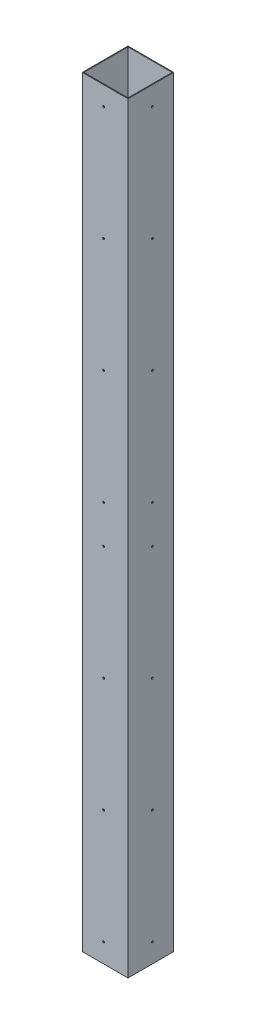
ISO-10303-21;
HEADER;
FILE_DESCRIPTION(('STEP AP214'),'2;1');
FILE_NAME('part.step','',(''),(''),'','','');
FILE_SCHEMA(('AUTOMOTIVE_DESIGN { 1 0 10303 214 1 1 1 1 }'));
ENDSEC;
DATA;
#1=APPLICATION_CONTEXT('core data for automotive mechanical design processes');
#2=APPLICATION_PROTOCOL_DEFINITION('international standard','automotive_design',2000,#1);
#3=PRODUCT_CONTEXT('',#1,'mechanical');
#4=PRODUCT('Part','Part','',(#3));
#5=PRODUCT_RELATED_PRODUCT_CATEGORY('part','',(#4));
#6=PRODUCT_DEFINITION_FORMATION('','',#4);
#7=PRODUCT_DEFINITION_CONTEXT('part definition',#1,'design');
#8=PRODUCT_DEFINITION('design','',#6,#7);
#9=PRODUCT_DEFINITION_SHAPE('','',#8);
#10=(LENGTH_UNIT() NAMED_UNIT(*) SI_UNIT(.MILLI.,.METRE.));
#11=(NAMED_UNIT(*) PLANE_ANGLE_UNIT() SI_UNIT($,.RADIAN.));
#12=(NAMED_UNIT(*) SI_UNIT($,.STERADIAN.) SOLID_ANGLE_UNIT());
#13=UNCERTAINTY_MEASURE_WITH_UNIT(LENGTH_MEASURE(1.E-05),#10,'distance_accuracy_value','');
#14=(GEOMETRIC_REPRESENTATION_CONTEXT(3) GLOBAL_UNCERTAINTY_ASSIGNED_CONTEXT((#13)) GLOBAL_UNIT_ASSIGNED_CONTEXT((#10,
#11,#12)) REPRESENTATION_CONTEXT('',''));
#15=CARTESIAN_POINT('',(0.,0.,0.));
#16=DIRECTION('',(0.,0.,1.));
#17=DIRECTION('',(1.,0.,0.));
#18=AXIS2_PLACEMENT_3D('',#15,#16,#17);
#19=CARTESIAN_POINT('',(0.,2000.,0.));
#20=DIRECTION('',(0.,1.,0.));
#21=DIRECTION('',(0.,0.,1.));
#22=AXIS2_PLACEMENT_3D('',#19,#20,#21);
#23=PLANE('',#22);
#24=DIRECTION('',(0.,0.,1.));
#25=VECTOR('',#24,1.);
#26=CARTESIAN_POINT('',(-60.,2000.,-60.));
#27=LINE('',#26,#25);
#28=CARTESIAN_POINT('',(-60.,2000.,-60.));
#29=VERTEX_POINT('',#28);
#30=CARTESIAN_POINT('',(-60.,2000.,60.));
#31=VERTEX_POINT('',#30);
#32=EDGE_CURVE('E164',#29,#31,#27,.T.);
#33=ORIENTED_EDGE('',*,*,#32,.T.);
#34=DIRECTION('',(1.,0.,0.));
#35=VECTOR('',#34,1.);
#36=CARTESIAN_POINT('',(-60.,2000.,60.));
#37=LINE('',#36,#35);
#38=CARTESIAN_POINT('',(60.,2000.,60.));
#39=VERTEX_POINT('',#38);
#40=EDGE_CURVE('E167',#31,#39,#37,.T.);
#41=ORIENTED_EDGE('',*,*,#40,.T.);
#42=DIRECTION('',(0.,0.,-1.));
#43=VECTOR('',#42,1.);
#44=CARTESIAN_POINT('',(60.,2000.,-60.));
#45=LINE('',#44,#43);
#46=CARTESIAN_POINT('',(60.,2000.,-60.));
#47=VERTEX_POINT('',#46);
#48=EDGE_CURVE('E170',#39,#47,#45,.T.);
#49=ORIENTED_EDGE('',*,*,#48,.T.);
#50=DIRECTION('',(-1.,0.,0.));
#51=VECTOR('',#50,1.);
#52=CARTESIAN_POINT('',(-60.,2000.,-60.));
#53=LINE('',#52,#51);
#54=EDGE_CURVE('E172',#47,#29,#53,.T.);
#55=ORIENTED_EDGE('',*,*,#54,.T.);
#56=EDGE_LOOP('',(#33,#41,#49,#55));
#57=FACE_BOUND('',#56,.T.);
#58=DIRECTION('',(1.,0.,0.));
#59=VECTOR('',#58,1.);
#60=CARTESIAN_POINT('',(-60.,2000.,58.));
#61=LINE('',#60,#59);
#62=CARTESIAN_POINT('',(-58.,2000.,58.));
#63=VERTEX_POINT('',#62);
#64=CARTESIAN_POINT('',(58.,2000.,58.));
#65=VERTEX_POINT('',#64);
#66=EDGE_CURVE('E134',#63,#65,#61,.T.);
#67=ORIENTED_EDGE('',*,*,#66,.F.);
#68=DIRECTION('',(0.,0.,1.));
#69=VECTOR('',#68,1.);
#70=CARTESIAN_POINT('',(-58.,2000.,-60.));
#71=LINE('',#70,#69);
#72=CARTESIAN_POINT('',(-58.,2000.,-58.));
#73=VERTEX_POINT('',#72);
#74=EDGE_CURVE('E126',#73,#63,#71,.T.);
#75=ORIENTED_EDGE('',*,*,#74,.F.);
#76=DIRECTION('',(-1.,0.,0.));
#77=VECTOR('',#76,1.);
#78=CARTESIAN_POINT('',(-60.,2000.,-58.));
#79=LINE('',#78,#77);
#80=CARTESIAN_POINT('',(58.,2000.,-58.));
#81=VERTEX_POINT('',#80);
#82=EDGE_CURVE('E148',#81,#73,#79,.T.);
#83=ORIENTED_EDGE('',*,*,#82,.F.);
#84=DIRECTION('',(0.,0.,-1.));
#85=VECTOR('',#84,1.);
#86=CARTESIAN_POINT('',(58.,2000.,-60.));
#87=LINE('',#86,#85);
#88=EDGE_CURVE('E146',#65,#81,#87,.T.);
#89=ORIENTED_EDGE('',*,*,#88,.F.);
#90=EDGE_LOOP('',(#67,#75,#83,#89));
#91=FACE_BOUND('',#90,.T.);
#92=ADVANCED_FACE('F59',(#57,#91),#23,.T.);
#93=CARTESIAN_POINT('',(0.,0.,0.));
#94=DIRECTION('',(0.,1.,0.));
#95=DIRECTION('',(0.,0.,1.));
#96=AXIS2_PLACEMENT_3D('',#93,#94,#95);
#97=PLANE('',#96);
#98=DIRECTION('',(0.,0.,1.));
#99=VECTOR('',#98,1.);
#100=CARTESIAN_POINT('',(-60.,0.,-60.));
#101=LINE('',#100,#99);
#102=CARTESIAN_POINT('',(-60.,0.,-60.));
#103=VERTEX_POINT('',#102);
#104=CARTESIAN_POINT('',(-60.,0.,60.));
#105=VERTEX_POINT('',#104);
#106=EDGE_CURVE('E142',#103,#105,#101,.T.);
#107=ORIENTED_EDGE('',*,*,#106,.F.);
#108=DIRECTION('',(-1.,0.,0.));
#109=VECTOR('',#108,1.);
#110=CARTESIAN_POINT('',(-60.,0.,-60.));
#111=LINE('',#110,#109);
#112=CARTESIAN_POINT('',(60.,0.,-60.));
#113=VERTEX_POINT('',#112);
#114=EDGE_CURVE('E168',#113,#103,#111,.T.);
#115=ORIENTED_EDGE('',*,*,#114,.F.);
#116=DIRECTION('',(0.,0.,-1.));
#117=VECTOR('',#116,1.);
#118=CARTESIAN_POINT('',(60.,0.,-60.));
#119=LINE('',#118,#117);
#120=CARTESIAN_POINT('',(60.,0.,60.));
#121=VERTEX_POINT('',#120);
#122=EDGE_CURVE('E179',#121,#113,#119,.T.);
#123=ORIENTED_EDGE('',*,*,#122,.F.);
#124=DIRECTION('',(1.,0.,0.));
#125=VECTOR('',#124,1.);
#126=CARTESIAN_POINT('',(-60.,0.,60.));
#127=LINE('',#126,#125);
#128=EDGE_CURVE('E177',#105,#121,#127,.T.);
#129=ORIENTED_EDGE('',*,*,#128,.F.);
#130=EDGE_LOOP('',(#107,#115,#123,#129));
#131=FACE_BOUND('',#130,.T.);
#132=DIRECTION('',(0.,0.,1.));
#133=VECTOR('',#132,1.);
#134=CARTESIAN_POINT('',(-58.,0.,-60.));
#135=LINE('',#134,#133);
#136=CARTESIAN_POINT('',(-58.,0.,-58.));
#137=VERTEX_POINT('',#136);
#138=CARTESIAN_POINT('',(-58.,0.,58.));
#139=VERTEX_POINT('',#138);
#140=EDGE_CURVE('E84',#137,#139,#135,.T.);
#141=ORIENTED_EDGE('',*,*,#140,.T.);
#142=DIRECTION('',(1.,0.,0.));
#143=VECTOR('',#142,1.);
#144=CARTESIAN_POINT('',(-60.,0.,58.));
#145=LINE('',#144,#143);
#146=CARTESIAN_POINT('',(58.,0.,58.));
#147=VERTEX_POINT('',#146);
#148=EDGE_CURVE('E141',#139,#147,#145,.T.);
#149=ORIENTED_EDGE('',*,*,#148,.T.);
#150=DIRECTION('',(0.,0.,-1.));
#151=VECTOR('',#150,1.);
#152=CARTESIAN_POINT('',(58.,0.,-60.));
#153=LINE('',#152,#151);
#154=CARTESIAN_POINT('',(58.,0.,-58.));
#155=VERTEX_POINT('',#154);
#156=EDGE_CURVE('E156',#147,#155,#153,.T.);
#157=ORIENTED_EDGE('',*,*,#156,.T.);
#158=DIRECTION('',(-1.,0.,0.));
#159=VECTOR('',#158,1.);
#160=CARTESIAN_POINT('',(-60.,0.,-58.));
#161=LINE('',#160,#159);
#162=EDGE_CURVE('E135',#155,#137,#161,.T.);
#163=ORIENTED_EDGE('',*,*,#162,.T.);
#164=EDGE_LOOP('',(#141,#149,#157,#163));
#165=FACE_BOUND('',#164,.T.);
#166=ADVANCED_FACE('F316',(#131,#165),#97,.F.);
#167=CARTESIAN_POINT('',(-60.,2000.,-60.));
#168=DIRECTION('',(1.,0.,0.));
#169=DIRECTION('',(0.,0.,-1.));
#170=AXIS2_PLACEMENT_3D('',#167,#168,#169);
#171=PLANE('',#170);
#172=ORIENTED_EDGE('',*,*,#106,.T.);
#173=DIRECTION('',(0.,-1.,0.));
#174=VECTOR('',#173,1.);
#175=CARTESIAN_POINT('',(-60.,2000.,60.));
#176=LINE('',#175,#174);
#177=EDGE_CURVE('E12',#31,#105,#176,.T.);
#178=ORIENTED_EDGE('',*,*,#177,.F.);
#179=ORIENTED_EDGE('',*,*,#32,.F.);
#180=DIRECTION('',(0.,-1.,0.));
#181=VECTOR('',#180,1.);
#182=CARTESIAN_POINT('',(-60.,2000.,-60.));
#183=LINE('',#182,#181);
#184=EDGE_CURVE('E174',#29,#103,#183,.T.);
#185=ORIENTED_EDGE('',*,*,#184,.T.);
#186=EDGE_LOOP('',(#172,#178,#179,#185));
#187=FACE_BOUND('',#186,.T.);
#188=ADVANCED_FACE('F61',(#187),#171,.F.);
#189=CARTESIAN_POINT('',(-60.,2000.,60.));
#190=DIRECTION('',(0.,0.,-1.));
#191=DIRECTION('',(-1.,0.,0.));
#192=AXIS2_PLACEMENT_3D('',#189,#190,#191);
#193=PLANE('',#192);
#194=CARTESIAN_POINT('',(-3.99999999999998,50.,60.));
#195=DIRECTION('',(0.,0.,1.));
#196=DIRECTION('',(1.,0.,0.));
#197=AXIS2_PLACEMENT_3D('',#194,#195,#196);
#198=CIRCLE('',#197,2.5);
#199=CARTESIAN_POINT('',(-1.49999999999998,50.,60.));
#200=VERTEX_POINT('',#199);
#201=EDGE_CURVE('E217',#200,#200,#198,.T.);
#202=ORIENTED_EDGE('',*,*,#201,.F.);
#203=EDGE_LOOP('',(#202));
#204=FACE_BOUND('',#203,.T.);
#205=CARTESIAN_POINT('',(-3.99999999999998,350.,60.));
#206=DIRECTION('',(0.,0.,1.));
#207=DIRECTION('',(1.,0.,0.));
#208=AXIS2_PLACEMENT_3D('',#205,#206,#207);
#209=CIRCLE('',#208,2.5);
#210=CARTESIAN_POINT('',(-1.49999999999998,350.,60.));
#211=VERTEX_POINT('',#210);
#212=EDGE_CURVE('E281',#211,#211,#209,.T.);
#213=ORIENTED_EDGE('',*,*,#212,.F.);
#214=EDGE_LOOP('',(#213));
#215=FACE_BOUND('',#214,.T.);
#216=CARTESIAN_POINT('',(-3.99999999999998,650.,60.));
#217=DIRECTION('',(0.,0.,1.));
#218=DIRECTION('',(1.,0.,0.));
#219=AXIS2_PLACEMENT_3D('',#216,#217,#218);
#220=CIRCLE('',#219,2.5);
#221=CARTESIAN_POINT('',(-1.49999999999998,650.,60.));
#222=VERTEX_POINT('',#221);
#223=EDGE_CURVE('E278',#222,#222,#220,.T.);
#224=ORIENTED_EDGE('',*,*,#223,.F.);
#225=EDGE_LOOP('',(#224));
#226=FACE_BOUND('',#225,.T.);
#227=CARTESIAN_POINT('',(-3.99999999999998,950.,60.));
#228=DIRECTION('',(0.,0.,1.));
#229=DIRECTION('',(1.,0.,0.));
#230=AXIS2_PLACEMENT_3D('',#227,#228,#229);
#231=CIRCLE('',#230,2.5);
#232=CARTESIAN_POINT('',(-1.49999999999998,950.,60.));
#233=VERTEX_POINT('',#232);
#234=EDGE_CURVE('E275',#233,#233,#231,.T.);
#235=ORIENTED_EDGE('',*,*,#234,.F.);
#236=EDGE_LOOP('',(#235));
#237=FACE_BOUND('',#236,.T.);
#238=CARTESIAN_POINT('',(-3.99999999999998,1050.,60.));
#239=DIRECTION('',(0.,0.,1.));
#240=DIRECTION('',(1.,0.,0.));
#241=AXIS2_PLACEMENT_3D('',#238,#239,#240);
#242=CIRCLE('',#241,2.49999999999989);
#243=CARTESIAN_POINT('',(-1.50000000000009,1050.,60.));
#244=VERTEX_POINT('',#243);
#245=EDGE_CURVE('E272',#244,#244,#242,.T.);
#246=ORIENTED_EDGE('',*,*,#245,.F.);
#247=EDGE_LOOP('',(#246));
#248=FACE_BOUND('',#247,.T.);
#249=CARTESIAN_POINT('',(-3.99999999999998,1350.,60.));
#250=DIRECTION('',(0.,0.,1.));
#251=DIRECTION('',(1.,0.,0.));
#252=AXIS2_PLACEMENT_3D('',#249,#250,#251);
#253=CIRCLE('',#252,2.49999999999989);
#254=CARTESIAN_POINT('',(-1.50000000000009,1350.,60.));
#255=VERTEX_POINT('',#254);
#256=EDGE_CURVE('E269',#255,#255,#253,.T.);
#257=ORIENTED_EDGE('',*,*,#256,.F.);
#258=EDGE_LOOP('',(#257));
#259=FACE_BOUND('',#258,.T.);
#260=CARTESIAN_POINT('',(-3.99999999999998,1650.,60.));
#261=DIRECTION('',(0.,0.,1.));
#262=DIRECTION('',(1.,0.,0.));
#263=AXIS2_PLACEMENT_3D('',#260,#261,#262);
#264=CIRCLE('',#263,2.50000000000012);
#265=CARTESIAN_POINT('',(-1.49999999999987,1650.,60.));
#266=VERTEX_POINT('',#265);
#267=EDGE_CURVE('E266',#266,#266,#264,.T.);
#268=ORIENTED_EDGE('',*,*,#267,.F.);
#269=EDGE_LOOP('',(#268));
#270=FACE_BOUND('',#269,.T.);
#271=CARTESIAN_POINT('',(-3.99999999999998,1950.,60.));
#272=DIRECTION('',(0.,0.,1.));
#273=DIRECTION('',(1.,0.,0.));
#274=AXIS2_PLACEMENT_3D('',#271,#272,#273);
#275=CIRCLE('',#274,2.49999999999989);
#276=CARTESIAN_POINT('',(-1.50000000000009,1950.,60.));
#277=VERTEX_POINT('',#276);
#278=EDGE_CURVE('E263',#277,#277,#275,.T.);
#279=ORIENTED_EDGE('',*,*,#278,.F.);
#280=EDGE_LOOP('',(#279));
#281=FACE_BOUND('',#280,.T.);
#282=ORIENTED_EDGE('',*,*,#128,.T.);
#283=DIRECTION('',(0.,-1.,0.));
#284=VECTOR('',#283,1.);
#285=CARTESIAN_POINT('',(60.,2000.,60.));
#286=LINE('',#285,#284);
#287=EDGE_CURVE('E68',#39,#121,#286,.T.);
#288=ORIENTED_EDGE('',*,*,#287,.F.);
#289=ORIENTED_EDGE('',*,*,#40,.F.);
#290=ORIENTED_EDGE('',*,*,#177,.T.);
#291=EDGE_LOOP('',(#282,#288,#289,#290));
#292=FACE_BOUND('',#291,.T.);
#293=ADVANCED_FACE('F289',(#204,#215,#226,#237,#248,#259,#270,#281,#292),#193,.F.);
#294=CARTESIAN_POINT('',(60.,2000.,-60.));
#295=DIRECTION('',(-1.,0.,0.));
#296=DIRECTION('',(0.,0.,1.));
#297=AXIS2_PLACEMENT_3D('',#294,#295,#296);
#298=PLANE('',#297);
#299=CARTESIAN_POINT('',(60.,50.,-4.));
#300=DIRECTION('',(1.,0.,0.));
#301=DIRECTION('',(0.,0.,-1.));
#302=AXIS2_PLACEMENT_3D('',#299,#300,#301);
#303=CIRCLE('',#302,2.5);
#304=CARTESIAN_POINT('',(60.,50.,-6.50000000000001));
#305=VERTEX_POINT('',#304);
#306=EDGE_CURVE('E193',#305,#305,#303,.T.);
#307=ORIENTED_EDGE('',*,*,#306,.F.);
#308=EDGE_LOOP('',(#307));
#309=FACE_BOUND('',#308,.T.);
#310=CARTESIAN_POINT('',(60.,350.,-4.));
#311=DIRECTION('',(1.,0.,0.));
#312=DIRECTION('',(0.,0.,-1.));
#313=AXIS2_PLACEMENT_3D('',#310,#311,#312);
#314=CIRCLE('',#313,2.5);
#315=CARTESIAN_POINT('',(60.,350.,-6.50000000000001));
#316=VERTEX_POINT('',#315);
#317=EDGE_CURVE('E258',#316,#316,#314,.T.);
#318=ORIENTED_EDGE('',*,*,#317,.F.);
#319=EDGE_LOOP('',(#318));
#320=FACE_BOUND('',#319,.T.);
#321=CARTESIAN_POINT('',(60.,650.,-4.));
#322=DIRECTION('',(1.,0.,0.));
#323=DIRECTION('',(0.,0.,-1.));
#324=AXIS2_PLACEMENT_3D('',#321,#322,#323);
#325=CIRCLE('',#324,2.5);
#326=CARTESIAN_POINT('',(60.,650.,-6.50000000000001));
#327=VERTEX_POINT('',#326);
#328=EDGE_CURVE('E255',#327,#327,#325,.T.);
#329=ORIENTED_EDGE('',*,*,#328,.F.);
#330=EDGE_LOOP('',(#329));
#331=FACE_BOUND('',#330,.T.);
#332=CARTESIAN_POINT('',(60.,950.,-4.));
#333=DIRECTION('',(1.,0.,0.));
#334=DIRECTION('',(0.,0.,-1.));
#335=AXIS2_PLACEMENT_3D('',#332,#333,#334);
#336=CIRCLE('',#335,2.5);
#337=CARTESIAN_POINT('',(60.,950.,-6.50000000000001));
#338=VERTEX_POINT('',#337);
#339=EDGE_CURVE('E252',#338,#338,#336,.T.);
#340=ORIENTED_EDGE('',*,*,#339,.F.);
#341=EDGE_LOOP('',(#340));
#342=FACE_BOUND('',#341,.T.);
#343=CARTESIAN_POINT('',(60.,1050.,-4.));
#344=DIRECTION('',(1.,0.,0.));
#345=DIRECTION('',(0.,0.,-1.));
#346=AXIS2_PLACEMENT_3D('',#343,#344,#345);
#347=CIRCLE('',#346,2.49999999999992);
#348=CARTESIAN_POINT('',(60.,1050.,-6.49999999999992));
#349=VERTEX_POINT('',#348);
#350=EDGE_CURVE('E249',#349,#349,#347,.T.);
#351=ORIENTED_EDGE('',*,*,#350,.F.);
#352=EDGE_LOOP('',(#351));
#353=FACE_BOUND('',#352,.T.);
#354=CARTESIAN_POINT('',(60.,1350.,-4.));
#355=DIRECTION('',(1.,0.,0.));
#356=DIRECTION('',(0.,0.,-1.));
#357=AXIS2_PLACEMENT_3D('',#354,#355,#356);
#358=CIRCLE('',#357,2.49999999999992);
#359=CARTESIAN_POINT('',(60.,1350.,-6.49999999999992));
#360=VERTEX_POINT('',#359);
#361=EDGE_CURVE('E244',#360,#360,#358,.T.);
#362=ORIENTED_EDGE('',*,*,#361,.F.);
#363=EDGE_LOOP('',(#362));
#364=FACE_BOUND('',#363,.T.);
#365=CARTESIAN_POINT('',(60.,1650.,-4.));
#366=DIRECTION('',(1.,0.,0.));
#367=DIRECTION('',(0.,0.,-1.));
#368=AXIS2_PLACEMENT_3D('',#365,#366,#367);
#369=CIRCLE('',#368,2.50000000000009);
#370=CARTESIAN_POINT('',(60.,1650.,-6.5000000000001));
#371=VERTEX_POINT('',#370);
#372=EDGE_CURVE('E240',#371,#371,#369,.T.);
#373=ORIENTED_EDGE('',*,*,#372,.F.);
#374=EDGE_LOOP('',(#373));
#375=FACE_BOUND('',#374,.T.);
#376=CARTESIAN_POINT('',(60.,1950.,-4.));
#377=DIRECTION('',(1.,0.,0.));
#378=DIRECTION('',(0.,0.,-1.));
#379=AXIS2_PLACEMENT_3D('',#376,#377,#378);
#380=CIRCLE('',#379,2.49999999999992);
#381=CARTESIAN_POINT('',(60.,1950.,-6.49999999999992));
#382=VERTEX_POINT('',#381);
#383=EDGE_CURVE('E236',#382,#382,#380,.T.);
#384=ORIENTED_EDGE('',*,*,#383,.F.);
#385=EDGE_LOOP('',(#384));
#386=FACE_BOUND('',#385,.T.);
#387=ORIENTED_EDGE('',*,*,#122,.T.);
#388=DIRECTION('',(0.,-1.,0.));
#389=VECTOR('',#388,1.);
#390=CARTESIAN_POINT('',(60.,2000.,-60.));
#391=LINE('',#390,#389);
#392=EDGE_CURVE('E184',#47,#113,#391,.T.);
#393=ORIENTED_EDGE('',*,*,#392,.F.);
#394=ORIENTED_EDGE('',*,*,#48,.F.);
#395=ORIENTED_EDGE('',*,*,#287,.T.);
#396=EDGE_LOOP('',(#387,#393,#394,#395));
#397=FACE_BOUND('',#396,.T.);
#398=ADVANCED_FACE('F292',(#309,#320,#331,#342,#353,#364,#375,#386,#397),#298,.F.);
#399=CARTESIAN_POINT('',(-60.,2000.,-60.));
#400=DIRECTION('',(0.,0.,1.));
#401=DIRECTION('',(1.,0.,0.));
#402=AXIS2_PLACEMENT_3D('',#399,#400,#401);
#403=PLANE('',#402);
#404=ORIENTED_EDGE('',*,*,#114,.T.);
#405=ORIENTED_EDGE('',*,*,#184,.F.);
#406=ORIENTED_EDGE('',*,*,#54,.F.);
#407=ORIENTED_EDGE('',*,*,#392,.T.);
#408=EDGE_LOOP('',(#404,#405,#406,#407));
#409=FACE_BOUND('',#408,.T.);
#410=ADVANCED_FACE('F320',(#409),#403,.F.);
#411=CARTESIAN_POINT('',(-58.,2000.,-60.));
#412=DIRECTION('',(1.,0.,0.));
#413=DIRECTION('',(0.,0.,-1.));
#414=AXIS2_PLACEMENT_3D('',#411,#412,#413);
#415=PLANE('',#414);
#416=ORIENTED_EDGE('',*,*,#140,.F.);
#417=DIRECTION('',(0.,-1.,0.));
#418=VECTOR('',#417,1.);
#419=CARTESIAN_POINT('',(-58.,2000.,-58.));
#420=LINE('',#419,#418);
#421=EDGE_CURVE('E130',#73,#137,#420,.T.);
#422=ORIENTED_EDGE('',*,*,#421,.F.);
#423=ORIENTED_EDGE('',*,*,#74,.T.);
#424=DIRECTION('',(0.,-1.,0.));
#425=VECTOR('',#424,1.);
#426=CARTESIAN_POINT('',(-58.,2000.,58.));
#427=LINE('',#426,#425);
#428=EDGE_CURVE('E129',#63,#139,#427,.T.);
#429=ORIENTED_EDGE('',*,*,#428,.T.);
#430=EDGE_LOOP('',(#416,#422,#423,#429));
#431=FACE_BOUND('',#430,.T.);
#432=ADVANCED_FACE('F128',(#431),#415,.T.);
#433=CARTESIAN_POINT('',(-60.,2000.,58.));
#434=DIRECTION('',(0.,0.,-1.));
#435=DIRECTION('',(-1.,0.,0.));
#436=AXIS2_PLACEMENT_3D('',#433,#434,#435);
#437=PLANE('',#436);
#438=CARTESIAN_POINT('',(-3.99999999999998,50.,58.));
#439=DIRECTION('',(0.,0.,-1.));
#440=DIRECTION('',(-1.,0.,0.));
#441=AXIS2_PLACEMENT_3D('',#438,#439,#440);
#442=CIRCLE('',#441,2.5);
#443=CARTESIAN_POINT('',(-6.49999999999999,50.,58.));
#444=VERTEX_POINT('',#443);
#445=EDGE_CURVE('E63',#444,#444,#442,.F.);
#446=ORIENTED_EDGE('',*,*,#445,.T.);
#447=EDGE_LOOP('',(#446));
#448=FACE_BOUND('',#447,.T.);
#449=CARTESIAN_POINT('',(-3.99999999999998,350.,58.));
#450=DIRECTION('',(0.,0.,-1.));
#451=DIRECTION('',(-1.,0.,0.));
#452=AXIS2_PLACEMENT_3D('',#449,#450,#451);
#453=CIRCLE('',#452,2.5);
#454=CARTESIAN_POINT('',(-6.49999999999999,350.,58.));
#455=VERTEX_POINT('',#454);
#456=EDGE_CURVE('E231',#455,#455,#453,.F.);
#457=ORIENTED_EDGE('',*,*,#456,.T.);
#458=EDGE_LOOP('',(#457));
#459=FACE_BOUND('',#458,.T.);
#460=CARTESIAN_POINT('',(-3.99999999999998,650.,58.));
#461=DIRECTION('',(0.,0.,-1.));
#462=DIRECTION('',(-1.,0.,0.));
#463=AXIS2_PLACEMENT_3D('',#460,#461,#462);
#464=CIRCLE('',#463,2.5);
#465=CARTESIAN_POINT('',(-6.49999999999999,650.,58.));
#466=VERTEX_POINT('',#465);
#467=EDGE_CURVE('E229',#466,#466,#464,.F.);
#468=ORIENTED_EDGE('',*,*,#467,.T.);
#469=EDGE_LOOP('',(#468));
#470=FACE_BOUND('',#469,.T.);
#471=CARTESIAN_POINT('',(-3.99999999999998,950.,58.));
#472=DIRECTION('',(0.,0.,-1.));
#473=DIRECTION('',(-1.,0.,0.));
#474=AXIS2_PLACEMENT_3D('',#471,#472,#473);
#475=CIRCLE('',#474,2.5);
#476=CARTESIAN_POINT('',(-6.49999999999999,950.,58.));
#477=VERTEX_POINT('',#476);
#478=EDGE_CURVE('E226',#477,#477,#475,.F.);
#479=ORIENTED_EDGE('',*,*,#478,.T.);
#480=EDGE_LOOP('',(#479));
#481=FACE_BOUND('',#480,.T.);
#482=CARTESIAN_POINT('',(-3.99999999999998,1050.,58.));
#483=DIRECTION('',(0.,0.,-1.));
#484=DIRECTION('',(-1.,0.,0.));
#485=AXIS2_PLACEMENT_3D('',#482,#483,#484);
#486=CIRCLE('',#485,2.49999999999989);
#487=CARTESIAN_POINT('',(-6.49999999999987,1050.,58.));
#488=VERTEX_POINT('',#487);
#489=EDGE_CURVE('E223',#488,#488,#486,.F.);
#490=ORIENTED_EDGE('',*,*,#489,.T.);
#491=EDGE_LOOP('',(#490));
#492=FACE_BOUND('',#491,.T.);
#493=CARTESIAN_POINT('',(-3.99999999999998,1350.,58.));
#494=DIRECTION('',(0.,0.,-1.));
#495=DIRECTION('',(-1.,0.,0.));
#496=AXIS2_PLACEMENT_3D('',#493,#494,#495);
#497=CIRCLE('',#496,2.49999999999989);
#498=CARTESIAN_POINT('',(-6.49999999999987,1350.,58.));
#499=VERTEX_POINT('',#498);
#500=EDGE_CURVE('E220',#499,#499,#497,.F.);
#501=ORIENTED_EDGE('',*,*,#500,.T.);
#502=EDGE_LOOP('',(#501));
#503=FACE_BOUND('',#502,.T.);
#504=CARTESIAN_POINT('',(-3.99999999999998,1650.,58.));
#505=DIRECTION('',(0.,0.,-1.));
#506=DIRECTION('',(-1.,0.,0.));
#507=AXIS2_PLACEMENT_3D('',#504,#505,#506);
#508=CIRCLE('',#507,2.50000000000012);
#509=CARTESIAN_POINT('',(-6.5000000000001,1650.,58.));
#510=VERTEX_POINT('',#509);
#511=EDGE_CURVE('E216',#510,#510,#508,.F.);
#512=ORIENTED_EDGE('',*,*,#511,.T.);
#513=EDGE_LOOP('',(#512));
#514=FACE_BOUND('',#513,.T.);
#515=CARTESIAN_POINT('',(-3.99999999999998,1950.,58.));
#516=DIRECTION('',(0.,0.,-1.));
#517=DIRECTION('',(-1.,0.,0.));
#518=AXIS2_PLACEMENT_3D('',#515,#516,#517);
#519=CIRCLE('',#518,2.49999999999989);
#520=CARTESIAN_POINT('',(-6.49999999999987,1950.,58.));
#521=VERTEX_POINT('',#520);
#522=EDGE_CURVE('E213',#521,#521,#519,.F.);
#523=ORIENTED_EDGE('',*,*,#522,.T.);
#524=EDGE_LOOP('',(#523));
#525=FACE_BOUND('',#524,.T.);
#526=ORIENTED_EDGE('',*,*,#148,.F.);
#527=ORIENTED_EDGE('',*,*,#428,.F.);
#528=ORIENTED_EDGE('',*,*,#66,.T.);
#529=DIRECTION('',(0.,-1.,0.));
#530=VECTOR('',#529,1.);
#531=CARTESIAN_POINT('',(58.,2000.,58.));
#532=LINE('',#531,#530);
#533=EDGE_CURVE('E143',#65,#147,#532,.T.);
#534=ORIENTED_EDGE('',*,*,#533,.T.);
#535=EDGE_LOOP('',(#526,#527,#528,#534));
#536=FACE_BOUND('',#535,.T.);
#537=ADVANCED_FACE('F138',(#448,#459,#470,#481,#492,#503,#514,#525,#536),#437,.T.);
#538=CARTESIAN_POINT('',(58.,2000.,-60.));
#539=DIRECTION('',(-1.,0.,0.));
#540=DIRECTION('',(0.,0.,1.));
#541=AXIS2_PLACEMENT_3D('',#538,#539,#540);
#542=PLANE('',#541);
#543=CARTESIAN_POINT('',(58.,50.,-4.));
#544=DIRECTION('',(-1.,0.,0.));
#545=DIRECTION('',(0.,0.,1.));
#546=AXIS2_PLACEMENT_3D('',#543,#544,#545);
#547=CIRCLE('',#546,2.5);
#548=CARTESIAN_POINT('',(58.,50.,-1.5));
#549=VERTEX_POINT('',#548);
#550=EDGE_CURVE('E154',#549,#549,#547,.F.);
#551=ORIENTED_EDGE('',*,*,#550,.T.);
#552=EDGE_LOOP('',(#551));
#553=FACE_BOUND('',#552,.T.);
#554=CARTESIAN_POINT('',(58.,350.,-4.));
#555=DIRECTION('',(-1.,0.,0.));
#556=DIRECTION('',(0.,0.,1.));
#557=AXIS2_PLACEMENT_3D('',#554,#555,#556);
#558=CIRCLE('',#557,2.5);
#559=CARTESIAN_POINT('',(58.,350.,-1.5));
#560=VERTEX_POINT('',#559);
#561=EDGE_CURVE('E208',#560,#560,#558,.F.);
#562=ORIENTED_EDGE('',*,*,#561,.T.);
#563=EDGE_LOOP('',(#562));
#564=FACE_BOUND('',#563,.T.);
#565=CARTESIAN_POINT('',(58.,650.,-4.));
#566=DIRECTION('',(-1.,0.,0.));
#567=DIRECTION('',(0.,0.,1.));
#568=AXIS2_PLACEMENT_3D('',#565,#566,#567);
#569=CIRCLE('',#568,2.5);
#570=CARTESIAN_POINT('',(58.,650.,-1.5));
#571=VERTEX_POINT('',#570);
#572=EDGE_CURVE('E205',#571,#571,#569,.F.);
#573=ORIENTED_EDGE('',*,*,#572,.T.);
#574=EDGE_LOOP('',(#573));
#575=FACE_BOUND('',#574,.T.);
#576=CARTESIAN_POINT('',(58.,950.,-4.));
#577=DIRECTION('',(-1.,0.,0.));
#578=DIRECTION('',(0.,0.,1.));
#579=AXIS2_PLACEMENT_3D('',#576,#577,#578);
#580=CIRCLE('',#579,2.5);
#581=CARTESIAN_POINT('',(58.,950.,-1.5));
#582=VERTEX_POINT('',#581);
#583=EDGE_CURVE('E202',#582,#582,#580,.F.);
#584=ORIENTED_EDGE('',*,*,#583,.T.);
#585=EDGE_LOOP('',(#584));
#586=FACE_BOUND('',#585,.T.);
#587=CARTESIAN_POINT('',(58.,1050.,-4.));
#588=DIRECTION('',(-1.,0.,0.));
#589=DIRECTION('',(0.,0.,1.));
#590=AXIS2_PLACEMENT_3D('',#587,#588,#589);
#591=CIRCLE('',#590,2.49999999999992);
#592=CARTESIAN_POINT('',(58.,1050.,-1.50000000000009));
#593=VERTEX_POINT('',#592);
#594=EDGE_CURVE('E199',#593,#593,#591,.F.);
#595=ORIENTED_EDGE('',*,*,#594,.T.);
#596=EDGE_LOOP('',(#595));
#597=FACE_BOUND('',#596,.T.);
#598=CARTESIAN_POINT('',(58.,1350.,-4.));
#599=DIRECTION('',(-1.,0.,0.));
#600=DIRECTION('',(0.,0.,1.));
#601=AXIS2_PLACEMENT_3D('',#598,#599,#600);
#602=CIRCLE('',#601,2.49999999999992);
#603=CARTESIAN_POINT('',(58.,1350.,-1.50000000000009));
#604=VERTEX_POINT('',#603);
#605=EDGE_CURVE('E196',#604,#604,#602,.F.);
#606=ORIENTED_EDGE('',*,*,#605,.T.);
#607=EDGE_LOOP('',(#606));
#608=FACE_BOUND('',#607,.T.);
#609=CARTESIAN_POINT('',(58.,1650.,-4.));
#610=DIRECTION('',(-1.,0.,0.));
#611=DIRECTION('',(0.,0.,1.));
#612=AXIS2_PLACEMENT_3D('',#609,#610,#611);
#613=CIRCLE('',#612,2.50000000000009);
#614=CARTESIAN_POINT('',(58.,1650.,-1.49999999999991));
#615=VERTEX_POINT('',#614);
#616=EDGE_CURVE('E192',#615,#615,#613,.F.);
#617=ORIENTED_EDGE('',*,*,#616,.T.);
#618=EDGE_LOOP('',(#617));
#619=FACE_BOUND('',#618,.T.);
#620=CARTESIAN_POINT('',(58.,1950.,-4.));
#621=DIRECTION('',(-1.,0.,0.));
#622=DIRECTION('',(0.,0.,1.));
#623=AXIS2_PLACEMENT_3D('',#620,#621,#622);
#624=CIRCLE('',#623,2.49999999999992);
#625=CARTESIAN_POINT('',(58.,1950.,-1.50000000000009));
#626=VERTEX_POINT('',#625);
#627=EDGE_CURVE('E189',#626,#626,#624,.F.);
#628=ORIENTED_EDGE('',*,*,#627,.T.);
#629=EDGE_LOOP('',(#628));
#630=FACE_BOUND('',#629,.T.);
#631=ORIENTED_EDGE('',*,*,#156,.F.);
#632=ORIENTED_EDGE('',*,*,#533,.F.);
#633=ORIENTED_EDGE('',*,*,#88,.T.);
#634=DIRECTION('',(0.,-1.,0.));
#635=VECTOR('',#634,1.);
#636=CARTESIAN_POINT('',(58.,2000.,-58.));
#637=LINE('',#636,#635);
#638=EDGE_CURVE('E76',#81,#155,#637,.T.);
#639=ORIENTED_EDGE('',*,*,#638,.T.);
#640=EDGE_LOOP('',(#631,#632,#633,#639));
#641=FACE_BOUND('',#640,.T.);
#642=ADVANCED_FACE('F376',(#553,#564,#575,#586,#597,#608,#619,#630,#641),#542,.T.);
#643=CARTESIAN_POINT('',(-60.,2000.,-58.));
#644=DIRECTION('',(0.,0.,1.));
#645=DIRECTION('',(1.,0.,0.));
#646=AXIS2_PLACEMENT_3D('',#643,#644,#645);
#647=PLANE('',#646);
#648=ORIENTED_EDGE('',*,*,#162,.F.);
#649=ORIENTED_EDGE('',*,*,#638,.F.);
#650=ORIENTED_EDGE('',*,*,#82,.T.);
#651=ORIENTED_EDGE('',*,*,#421,.T.);
#652=EDGE_LOOP('',(#648,#649,#650,#651));
#653=FACE_BOUND('',#652,.T.);
#654=ADVANCED_FACE('F368',(#653),#647,.T.);
#655=CARTESIAN_POINT('',(60.,1950.,-4.));
#656=DIRECTION('',(-1.,0.,0.));
#657=DIRECTION('',(0.,0.,1.));
#658=AXIS2_PLACEMENT_3D('',#655,#656,#657);
#659=CYLINDRICAL_SURFACE('',#658,2.49999999999992);
#660=ORIENTED_EDGE('',*,*,#627,.F.);
#661=EDGE_LOOP('',(#660));
#662=FACE_BOUND('',#661,.T.);
#663=ORIENTED_EDGE('',*,*,#383,.T.);
#664=EDGE_LOOP('',(#663));
#665=FACE_BOUND('',#664,.T.);
#666=ADVANCED_FACE('F358',(#662,#665),#659,.F.);
#667=CARTESIAN_POINT('',(60.,1650.,-4.));
#668=DIRECTION('',(-1.,0.,0.));
#669=DIRECTION('',(0.,0.,1.));
#670=AXIS2_PLACEMENT_3D('',#667,#668,#669);
#671=CYLINDRICAL_SURFACE('',#670,2.50000000000009);
#672=ORIENTED_EDGE('',*,*,#616,.F.);
#673=EDGE_LOOP('',(#672));
#674=FACE_BOUND('',#673,.T.);
#675=ORIENTED_EDGE('',*,*,#372,.T.);
#676=EDGE_LOOP('',(#675));
#677=FACE_BOUND('',#676,.T.);
#678=ADVANCED_FACE('F355',(#674,#677),#671,.F.);
#679=CARTESIAN_POINT('',(60.,1350.,-4.));
#680=DIRECTION('',(-1.,0.,0.));
#681=DIRECTION('',(0.,0.,1.));
#682=AXIS2_PLACEMENT_3D('',#679,#680,#681);
#683=CYLINDRICAL_SURFACE('',#682,2.49999999999992);
#684=ORIENTED_EDGE('',*,*,#605,.F.);
#685=EDGE_LOOP('',(#684));
#686=FACE_BOUND('',#685,.T.);
#687=ORIENTED_EDGE('',*,*,#361,.T.);
#688=EDGE_LOOP('',(#687));
#689=FACE_BOUND('',#688,.T.);
#690=ADVANCED_FACE('F357',(#686,#689),#683,.F.);
#691=CARTESIAN_POINT('',(60.,1050.,-4.));
#692=DIRECTION('',(-1.,0.,0.));
#693=DIRECTION('',(0.,0.,1.));
#694=AXIS2_PLACEMENT_3D('',#691,#692,#693);
#695=CYLINDRICAL_SURFACE('',#694,2.49999999999992);
#696=ORIENTED_EDGE('',*,*,#594,.F.);
#697=EDGE_LOOP('',(#696));
#698=FACE_BOUND('',#697,.T.);
#699=ORIENTED_EDGE('',*,*,#350,.T.);
#700=EDGE_LOOP('',(#699));
#701=FACE_BOUND('',#700,.T.);
#702=ADVANCED_FACE('F365',(#698,#701),#695,.F.);
#703=CARTESIAN_POINT('',(60.,950.,-4.));
#704=DIRECTION('',(-1.,0.,0.));
#705=DIRECTION('',(0.,0.,1.));
#706=AXIS2_PLACEMENT_3D('',#703,#704,#705);
#707=CYLINDRICAL_SURFACE('',#706,2.5);
#708=ORIENTED_EDGE('',*,*,#583,.F.);
#709=EDGE_LOOP('',(#708));
#710=FACE_BOUND('',#709,.T.);
#711=ORIENTED_EDGE('',*,*,#339,.T.);
#712=EDGE_LOOP('',(#711));
#713=FACE_BOUND('',#712,.T.);
#714=ADVANCED_FACE('F420',(#710,#713),#707,.F.);
#715=CARTESIAN_POINT('',(60.,650.,-4.));
#716=DIRECTION('',(-1.,0.,0.));
#717=DIRECTION('',(0.,0.,1.));
#718=AXIS2_PLACEMENT_3D('',#715,#716,#717);
#719=CYLINDRICAL_SURFACE('',#718,2.5);
#720=ORIENTED_EDGE('',*,*,#572,.F.);
#721=EDGE_LOOP('',(#720));
#722=FACE_BOUND('',#721,.T.);
#723=ORIENTED_EDGE('',*,*,#328,.T.);
#724=EDGE_LOOP('',(#723));
#725=FACE_BOUND('',#724,.T.);
#726=ADVANCED_FACE('F416',(#722,#725),#719,.F.);
#727=CARTESIAN_POINT('',(60.,350.,-4.));
#728=DIRECTION('',(-1.,0.,0.));
#729=DIRECTION('',(0.,0.,1.));
#730=AXIS2_PLACEMENT_3D('',#727,#728,#729);
#731=CYLINDRICAL_SURFACE('',#730,2.5);
#732=ORIENTED_EDGE('',*,*,#561,.F.);
#733=EDGE_LOOP('',(#732));
#734=FACE_BOUND('',#733,.T.);
#735=ORIENTED_EDGE('',*,*,#317,.T.);
#736=EDGE_LOOP('',(#735));
#737=FACE_BOUND('',#736,.T.);
#738=ADVANCED_FACE('F409',(#734,#737),#731,.F.);
#739=CARTESIAN_POINT('',(60.,50.,-4.));
#740=DIRECTION('',(-1.,0.,0.));
#741=DIRECTION('',(0.,0.,1.));
#742=AXIS2_PLACEMENT_3D('',#739,#740,#741);
#743=CYLINDRICAL_SURFACE('',#742,2.5);
#744=ORIENTED_EDGE('',*,*,#550,.F.);
#745=EDGE_LOOP('',(#744));
#746=FACE_BOUND('',#745,.T.);
#747=ORIENTED_EDGE('',*,*,#306,.T.);
#748=EDGE_LOOP('',(#747));
#749=FACE_BOUND('',#748,.T.);
#750=ADVANCED_FACE('F400',(#746,#749),#743,.F.);
#751=CARTESIAN_POINT('',(-3.99999999999998,1950.,60.));
#752=DIRECTION('',(0.,0.,-1.));
#753=DIRECTION('',(-1.,0.,0.));
#754=AXIS2_PLACEMENT_3D('',#751,#752,#753);
#755=CYLINDRICAL_SURFACE('',#754,2.49999999999989);
#756=ORIENTED_EDGE('',*,*,#522,.F.);
#757=EDGE_LOOP('',(#756));
#758=FACE_BOUND('',#757,.T.);
#759=ORIENTED_EDGE('',*,*,#278,.T.);
#760=EDGE_LOOP('',(#759));
#761=FACE_BOUND('',#760,.T.);
#762=ADVANCED_FACE('F396',(#758,#761),#755,.F.);
#763=CARTESIAN_POINT('',(-3.99999999999998,1650.,60.));
#764=DIRECTION('',(0.,0.,-1.));
#765=DIRECTION('',(-1.,0.,0.));
#766=AXIS2_PLACEMENT_3D('',#763,#764,#765);
#767=CYLINDRICAL_SURFACE('',#766,2.50000000000012);
#768=ORIENTED_EDGE('',*,*,#511,.F.);
#769=EDGE_LOOP('',(#768));
#770=FACE_BOUND('',#769,.T.);
#771=ORIENTED_EDGE('',*,*,#267,.T.);
#772=EDGE_LOOP('',(#771));
#773=FACE_BOUND('',#772,.T.);
#774=ADVANCED_FACE('F399',(#770,#773),#767,.F.);
#775=CARTESIAN_POINT('',(-3.99999999999998,1350.,60.));
#776=DIRECTION('',(0.,0.,-1.));
#777=DIRECTION('',(-1.,0.,0.));
#778=AXIS2_PLACEMENT_3D('',#775,#776,#777);
#779=CYLINDRICAL_SURFACE('',#778,2.49999999999989);
#780=ORIENTED_EDGE('',*,*,#500,.F.);
#781=EDGE_LOOP('',(#780));
#782=FACE_BOUND('',#781,.T.);
#783=ORIENTED_EDGE('',*,*,#256,.T.);
#784=EDGE_LOOP('',(#783));
#785=FACE_BOUND('',#784,.T.);
#786=ADVANCED_FACE('F406',(#782,#785),#779,.F.);
#787=CARTESIAN_POINT('',(-3.99999999999998,1050.,60.));
#788=DIRECTION('',(0.,0.,-1.));
#789=DIRECTION('',(-1.,0.,0.));
#790=AXIS2_PLACEMENT_3D('',#787,#788,#789);
#791=CYLINDRICAL_SURFACE('',#790,2.49999999999989);
#792=ORIENTED_EDGE('',*,*,#489,.F.);
#793=EDGE_LOOP('',(#792));
#794=FACE_BOUND('',#793,.T.);
#795=ORIENTED_EDGE('',*,*,#245,.T.);
#796=EDGE_LOOP('',(#795));
#797=FACE_BOUND('',#796,.T.);
#798=ADVANCED_FACE('F491',(#794,#797),#791,.F.);
#799=CARTESIAN_POINT('',(-3.99999999999998,950.,60.));
#800=DIRECTION('',(0.,0.,-1.));
#801=DIRECTION('',(-1.,0.,0.));
#802=AXIS2_PLACEMENT_3D('',#799,#800,#801);
#803=CYLINDRICAL_SURFACE('',#802,2.5);
#804=ORIENTED_EDGE('',*,*,#478,.F.);
#805=EDGE_LOOP('',(#804));
#806=FACE_BOUND('',#805,.T.);
#807=ORIENTED_EDGE('',*,*,#234,.T.);
#808=EDGE_LOOP('',(#807));
#809=FACE_BOUND('',#808,.T.);
#810=ADVANCED_FACE('F500',(#806,#809),#803,.F.);
#811=CARTESIAN_POINT('',(-3.99999999999998,650.,60.));
#812=DIRECTION('',(0.,0.,-1.));
#813=DIRECTION('',(-1.,0.,0.));
#814=AXIS2_PLACEMENT_3D('',#811,#812,#813);
#815=CYLINDRICAL_SURFACE('',#814,2.5);
#816=ORIENTED_EDGE('',*,*,#467,.F.);
#817=EDGE_LOOP('',(#816));
#818=FACE_BOUND('',#817,.T.);
#819=ORIENTED_EDGE('',*,*,#223,.T.);
#820=EDGE_LOOP('',(#819));
#821=FACE_BOUND('',#820,.T.);
#822=ADVANCED_FACE('F510',(#818,#821),#815,.F.);
#823=CARTESIAN_POINT('',(-3.99999999999998,350.,60.));
#824=DIRECTION('',(0.,0.,-1.));
#825=DIRECTION('',(-1.,0.,0.));
#826=AXIS2_PLACEMENT_3D('',#823,#824,#825);
#827=CYLINDRICAL_SURFACE('',#826,2.5);
#828=ORIENTED_EDGE('',*,*,#456,.F.);
#829=EDGE_LOOP('',(#828));
#830=FACE_BOUND('',#829,.T.);
#831=ORIENTED_EDGE('',*,*,#212,.T.);
#832=EDGE_LOOP('',(#831));
#833=FACE_BOUND('',#832,.T.);
#834=ADVANCED_FACE('F520',(#830,#833),#827,.F.);
#835=CARTESIAN_POINT('',(-3.99999999999998,50.,60.));
#836=DIRECTION('',(0.,0.,-1.));
#837=DIRECTION('',(-1.,0.,0.));
#838=AXIS2_PLACEMENT_3D('',#835,#836,#837);
#839=CYLINDRICAL_SURFACE('',#838,2.5);
#840=ORIENTED_EDGE('',*,*,#445,.F.);
#841=EDGE_LOOP('',(#840));
#842=FACE_BOUND('',#841,.T.);
#843=ORIENTED_EDGE('',*,*,#201,.T.);
#844=EDGE_LOOP('',(#843));
#845=FACE_BOUND('',#844,.T.);
#846=ADVANCED_FACE('F287',(#842,#845),#839,.F.);
#847=CLOSED_SHELL('',(#92,#166,#188,#293,#398,#410,#432,#537,#642,#654,#666,#678,#690,#702,#714,
#726,#738,#750,#762,#774,#786,#798,#810,#822,#834,#846));
#848=MANIFOLD_SOLID_BREP('B2',#847);
#849=ADVANCED_BREP_SHAPE_REPRESENTATION('',(#18,#848),#14);
#850=SHAPE_DEFINITION_REPRESENTATION(#9,#849);
ENDSEC;
END-ISO-10303-21;
